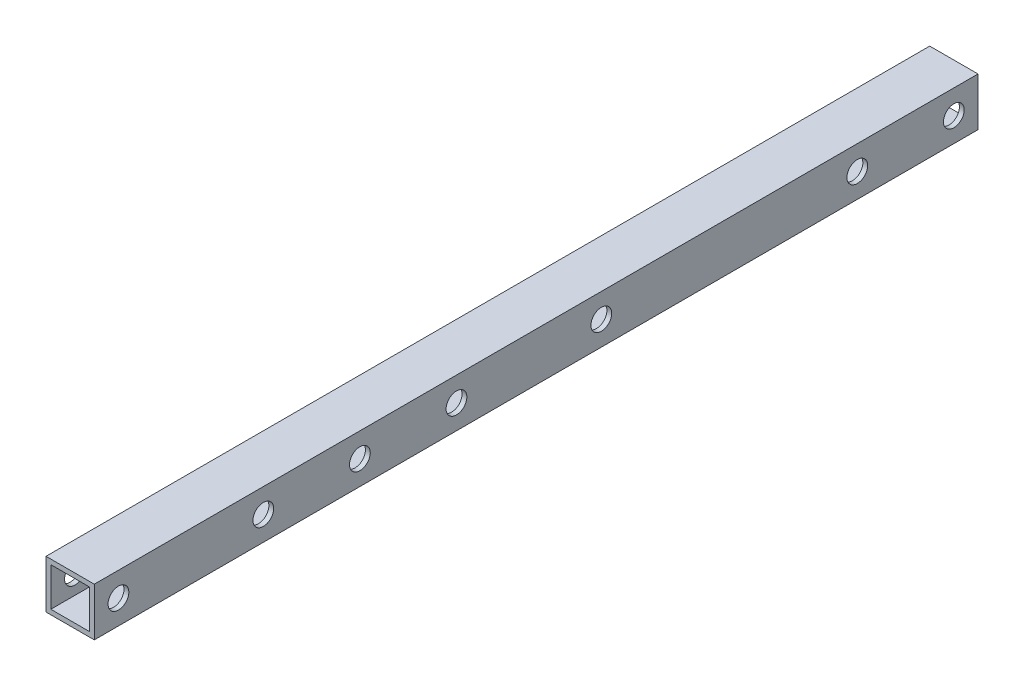
ISO-10303-21;
HEADER;
FILE_DESCRIPTION(('STEP AP214'),'2;1');
FILE_NAME('part.step','',(''),(''),'','','');
FILE_SCHEMA(('AUTOMOTIVE_DESIGN { 1 0 10303 214 1 1 1 1 }'));
ENDSEC;
DATA;
#1=APPLICATION_CONTEXT('core data for automotive mechanical design processes');
#2=APPLICATION_PROTOCOL_DEFINITION('international standard','automotive_design',2000,#1);
#3=PRODUCT_CONTEXT('',#1,'mechanical');
#4=PRODUCT('Part','Part','',(#3));
#5=PRODUCT_RELATED_PRODUCT_CATEGORY('part','',(#4));
#6=PRODUCT_DEFINITION_FORMATION('','',#4);
#7=PRODUCT_DEFINITION_CONTEXT('part definition',#1,'design');
#8=PRODUCT_DEFINITION('design','',#6,#7);
#9=PRODUCT_DEFINITION_SHAPE('','',#8);
#10=(LENGTH_UNIT() NAMED_UNIT(*) SI_UNIT(.MILLI.,.METRE.));
#11=(NAMED_UNIT(*) PLANE_ANGLE_UNIT() SI_UNIT($,.RADIAN.));
#12=(NAMED_UNIT(*) SI_UNIT($,.STERADIAN.) SOLID_ANGLE_UNIT());
#13=UNCERTAINTY_MEASURE_WITH_UNIT(LENGTH_MEASURE(1.E-05),#10,'distance_accuracy_value','');
#14=(GEOMETRIC_REPRESENTATION_CONTEXT(3) GLOBAL_UNCERTAINTY_ASSIGNED_CONTEXT((#13)) GLOBAL_UNIT_ASSIGNED_CONTEXT((#10,
#11,#12)) REPRESENTATION_CONTEXT('',''));
#15=CARTESIAN_POINT('',(0.,0.,0.));
#16=DIRECTION('',(0.,0.,1.));
#17=DIRECTION('',(1.,0.,0.));
#18=AXIS2_PLACEMENT_3D('',#15,#16,#17);
#19=CARTESIAN_POINT('',(0.,0.,183.));
#20=DIRECTION('',(0.,0.,1.));
#21=DIRECTION('',(1.,0.,0.));
#22=AXIS2_PLACEMENT_3D('',#19,#20,#21);
#23=PLANE('',#22);
#24=DIRECTION('',(0.,1.,0.));
#25=VECTOR('',#24,1.);
#26=CARTESIAN_POINT('',(5.,5.,183.));
#27=LINE('',#26,#25);
#28=CARTESIAN_POINT('',(5.,-5.,183.));
#29=VERTEX_POINT('',#28);
#30=CARTESIAN_POINT('',(5.,5.,183.));
#31=VERTEX_POINT('',#30);
#32=EDGE_CURVE('E164',#29,#31,#27,.T.);
#33=ORIENTED_EDGE('',*,*,#32,.T.);
#34=DIRECTION('',(-1.,0.,0.));
#35=VECTOR('',#34,1.);
#36=CARTESIAN_POINT('',(-5.,5.,183.));
#37=LINE('',#36,#35);
#38=CARTESIAN_POINT('',(-5.,5.,183.));
#39=VERTEX_POINT('',#38);
#40=EDGE_CURVE('E167',#31,#39,#37,.T.);
#41=ORIENTED_EDGE('',*,*,#40,.T.);
#42=DIRECTION('',(0.,-1.,0.));
#43=VECTOR('',#42,1.);
#44=CARTESIAN_POINT('',(-5.,5.,183.));
#45=LINE('',#44,#43);
#46=CARTESIAN_POINT('',(-5.,-5.,183.));
#47=VERTEX_POINT('',#46);
#48=EDGE_CURVE('E170',#39,#47,#45,.T.);
#49=ORIENTED_EDGE('',*,*,#48,.T.);
#50=DIRECTION('',(1.,0.,0.));
#51=VECTOR('',#50,1.);
#52=CARTESIAN_POINT('',(-5.,-5.,183.));
#53=LINE('',#52,#51);
#54=EDGE_CURVE('E172',#47,#29,#53,.T.);
#55=ORIENTED_EDGE('',*,*,#54,.T.);
#56=EDGE_LOOP('',(#33,#41,#49,#55));
#57=FACE_BOUND('',#56,.T.);
#58=DIRECTION('',(-1.,0.,0.));
#59=VECTOR('',#58,1.);
#60=CARTESIAN_POINT('',(-5.,4.,183.));
#61=LINE('',#60,#59);
#62=CARTESIAN_POINT('',(4.,4.,183.));
#63=VERTEX_POINT('',#62);
#64=CARTESIAN_POINT('',(-4.,4.,183.));
#65=VERTEX_POINT('',#64);
#66=EDGE_CURVE('E134',#63,#65,#61,.T.);
#67=ORIENTED_EDGE('',*,*,#66,.F.);
#68=DIRECTION('',(0.,1.,0.));
#69=VECTOR('',#68,1.);
#70=CARTESIAN_POINT('',(4.,5.,183.));
#71=LINE('',#70,#69);
#72=CARTESIAN_POINT('',(4.,-4.,183.));
#73=VERTEX_POINT('',#72);
#74=EDGE_CURVE('E126',#73,#63,#71,.T.);
#75=ORIENTED_EDGE('',*,*,#74,.F.);
#76=DIRECTION('',(1.,0.,0.));
#77=VECTOR('',#76,1.);
#78=CARTESIAN_POINT('',(-5.,-4.,183.));
#79=LINE('',#78,#77);
#80=CARTESIAN_POINT('',(-4.,-4.,183.));
#81=VERTEX_POINT('',#80);
#82=EDGE_CURVE('E148',#81,#73,#79,.T.);
#83=ORIENTED_EDGE('',*,*,#82,.F.);
#84=DIRECTION('',(0.,-1.,0.));
#85=VECTOR('',#84,1.);
#86=CARTESIAN_POINT('',(-4.,5.,183.));
#87=LINE('',#86,#85);
#88=EDGE_CURVE('E146',#65,#81,#87,.T.);
#89=ORIENTED_EDGE('',*,*,#88,.F.);
#90=EDGE_LOOP('',(#67,#75,#83,#89));
#91=FACE_BOUND('',#90,.T.);
#92=ADVANCED_FACE('F59',(#57,#91),#23,.T.);
#93=CARTESIAN_POINT('',(0.,0.,0.));
#94=DIRECTION('',(0.,0.,1.));
#95=DIRECTION('',(1.,0.,0.));
#96=AXIS2_PLACEMENT_3D('',#93,#94,#95);
#97=PLANE('',#96);
#98=DIRECTION('',(0.,1.,0.));
#99=VECTOR('',#98,1.);
#100=CARTESIAN_POINT('',(5.,5.,0.));
#101=LINE('',#100,#99);
#102=CARTESIAN_POINT('',(5.,-5.,0.));
#103=VERTEX_POINT('',#102);
#104=CARTESIAN_POINT('',(5.,5.,0.));
#105=VERTEX_POINT('',#104);
#106=EDGE_CURVE('E142',#103,#105,#101,.T.);
#107=ORIENTED_EDGE('',*,*,#106,.F.);
#108=DIRECTION('',(1.,0.,0.));
#109=VECTOR('',#108,1.);
#110=CARTESIAN_POINT('',(-5.,-5.,0.));
#111=LINE('',#110,#109);
#112=CARTESIAN_POINT('',(-5.,-5.,0.));
#113=VERTEX_POINT('',#112);
#114=EDGE_CURVE('E168',#113,#103,#111,.T.);
#115=ORIENTED_EDGE('',*,*,#114,.F.);
#116=DIRECTION('',(0.,-1.,0.));
#117=VECTOR('',#116,1.);
#118=CARTESIAN_POINT('',(-5.,5.,0.));
#119=LINE('',#118,#117);
#120=CARTESIAN_POINT('',(-5.,5.,0.));
#121=VERTEX_POINT('',#120);
#122=EDGE_CURVE('E179',#121,#113,#119,.T.);
#123=ORIENTED_EDGE('',*,*,#122,.F.);
#124=DIRECTION('',(-1.,0.,0.));
#125=VECTOR('',#124,1.);
#126=CARTESIAN_POINT('',(-5.,5.,0.));
#127=LINE('',#126,#125);
#128=EDGE_CURVE('E177',#105,#121,#127,.T.);
#129=ORIENTED_EDGE('',*,*,#128,.F.);
#130=EDGE_LOOP('',(#107,#115,#123,#129));
#131=FACE_BOUND('',#130,.T.);
#132=DIRECTION('',(0.,1.,0.));
#133=VECTOR('',#132,1.);
#134=CARTESIAN_POINT('',(4.,5.,0.));
#135=LINE('',#134,#133);
#136=CARTESIAN_POINT('',(4.,-4.,0.));
#137=VERTEX_POINT('',#136);
#138=CARTESIAN_POINT('',(4.,4.,0.));
#139=VERTEX_POINT('',#138);
#140=EDGE_CURVE('E84',#137,#139,#135,.T.);
#141=ORIENTED_EDGE('',*,*,#140,.T.);
#142=DIRECTION('',(-1.,0.,0.));
#143=VECTOR('',#142,1.);
#144=CARTESIAN_POINT('',(-5.,4.,0.));
#145=LINE('',#144,#143);
#146=CARTESIAN_POINT('',(-4.,4.,0.));
#147=VERTEX_POINT('',#146);
#148=EDGE_CURVE('E141',#139,#147,#145,.T.);
#149=ORIENTED_EDGE('',*,*,#148,.T.);
#150=DIRECTION('',(0.,-1.,0.));
#151=VECTOR('',#150,1.);
#152=CARTESIAN_POINT('',(-4.,5.,0.));
#153=LINE('',#152,#151);
#154=CARTESIAN_POINT('',(-4.,-4.,0.));
#155=VERTEX_POINT('',#154);
#156=EDGE_CURVE('E156',#147,#155,#153,.T.);
#157=ORIENTED_EDGE('',*,*,#156,.T.);
#158=DIRECTION('',(1.,0.,0.));
#159=VECTOR('',#158,1.);
#160=CARTESIAN_POINT('',(-5.,-4.,0.));
#161=LINE('',#160,#159);
#162=EDGE_CURVE('E135',#155,#137,#161,.T.);
#163=ORIENTED_EDGE('',*,*,#162,.T.);
#164=EDGE_LOOP('',(#141,#149,#157,#163));
#165=FACE_BOUND('',#164,.T.);
#166=ADVANCED_FACE('F249',(#131,#165),#97,.F.);
#167=CARTESIAN_POINT('',(5.,5.,183.));
#168=DIRECTION('',(-1.,0.,0.));
#169=DIRECTION('',(0.,-1.,0.));
#170=AXIS2_PLACEMENT_3D('',#167,#168,#169);
#171=PLANE('',#170);
#172=CARTESIAN_POINT('',(5.,0.,25.));
#173=DIRECTION('',(1.,0.,0.));
#174=DIRECTION('',(0.,1.,0.));
#175=AXIS2_PLACEMENT_3D('',#172,#173,#174);
#176=CIRCLE('',#175,2.15);
#177=CARTESIAN_POINT('',(5.,2.15,25.));
#178=VERTEX_POINT('',#177);
#179=EDGE_CURVE('E302',#178,#178,#176,.T.);
#180=ORIENTED_EDGE('',*,*,#179,.F.);
#181=EDGE_LOOP('',(#180));
#182=FACE_BOUND('',#181,.T.);
#183=CARTESIAN_POINT('',(5.,0.,5.));
#184=DIRECTION('',(1.,0.,0.));
#185=DIRECTION('',(0.,-1.,0.));
#186=AXIS2_PLACEMENT_3D('',#183,#184,#185);
#187=CIRCLE('',#186,2.14999999999996);
#188=CARTESIAN_POINT('',(5.,-2.14999999999996,5.));
#189=VERTEX_POINT('',#188);
#190=EDGE_CURVE('E306',#189,#189,#187,.T.);
#191=ORIENTED_EDGE('',*,*,#190,.F.);
#192=EDGE_LOOP('',(#191));
#193=FACE_BOUND('',#192,.T.);
#194=CARTESIAN_POINT('',(5.,0.,108.));
#195=DIRECTION('',(1.,0.,0.));
#196=DIRECTION('',(0.,1.,0.));
#197=AXIS2_PLACEMENT_3D('',#194,#195,#196);
#198=CIRCLE('',#197,2.15000000000002);
#199=CARTESIAN_POINT('',(5.,2.15000000000002,108.));
#200=VERTEX_POINT('',#199);
#201=EDGE_CURVE('E310',#200,#200,#198,.T.);
#202=ORIENTED_EDGE('',*,*,#201,.F.);
#203=EDGE_LOOP('',(#202));
#204=FACE_BOUND('',#203,.T.);
#205=CARTESIAN_POINT('',(5.,0.,148.));
#206=DIRECTION('',(1.,0.,0.));
#207=DIRECTION('',(0.,-1.,0.));
#208=AXIS2_PLACEMENT_3D('',#205,#206,#207);
#209=CIRCLE('',#208,2.15000000000002);
#210=CARTESIAN_POINT('',(5.,-2.15000000000002,148.));
#211=VERTEX_POINT('',#210);
#212=EDGE_CURVE('E314',#211,#211,#209,.T.);
#213=ORIENTED_EDGE('',*,*,#212,.F.);
#214=EDGE_LOOP('',(#213));
#215=FACE_BOUND('',#214,.T.);
#216=CARTESIAN_POINT('',(5.,0.,178.));
#217=DIRECTION('',(1.,0.,0.));
#218=DIRECTION('',(0.,1.,0.));
#219=AXIS2_PLACEMENT_3D('',#216,#217,#218);
#220=CIRCLE('',#219,2.15000000000002);
#221=CARTESIAN_POINT('',(5.,2.15000000000001,178.));
#222=VERTEX_POINT('',#221);
#223=EDGE_CURVE('E318',#222,#222,#220,.T.);
#224=ORIENTED_EDGE('',*,*,#223,.F.);
#225=EDGE_LOOP('',(#224));
#226=FACE_BOUND('',#225,.T.);
#227=CARTESIAN_POINT('',(5.,0.,78.));
#228=DIRECTION('',(1.,0.,0.));
#229=DIRECTION('',(0.,-1.,0.));
#230=AXIS2_PLACEMENT_3D('',#227,#228,#229);
#231=CIRCLE('',#230,2.15000000000002);
#232=CARTESIAN_POINT('',(5.,-2.15000000000001,78.));
#233=VERTEX_POINT('',#232);
#234=EDGE_CURVE('E322',#233,#233,#231,.T.);
#235=ORIENTED_EDGE('',*,*,#234,.F.);
#236=EDGE_LOOP('',(#235));
#237=FACE_BOUND('',#236,.T.);
#238=CARTESIAN_POINT('',(5.,0.,128.));
#239=DIRECTION('',(1.,0.,0.));
#240=DIRECTION('',(0.,1.,0.));
#241=AXIS2_PLACEMENT_3D('',#238,#239,#240);
#242=CIRCLE('',#241,2.15000000000002);
#243=CARTESIAN_POINT('',(5.,2.15000000000002,128.));
#244=VERTEX_POINT('',#243);
#245=EDGE_CURVE('E325',#244,#244,#242,.T.);
#246=ORIENTED_EDGE('',*,*,#245,.F.);
#247=EDGE_LOOP('',(#246));
#248=FACE_BOUND('',#247,.T.);
#249=ORIENTED_EDGE('',*,*,#106,.T.);
#250=DIRECTION('',(0.,0.,-1.));
#251=VECTOR('',#250,1.);
#252=CARTESIAN_POINT('',(5.,5.,183.));
#253=LINE('',#252,#251);
#254=EDGE_CURVE('E12',#31,#105,#253,.T.);
#255=ORIENTED_EDGE('',*,*,#254,.F.);
#256=ORIENTED_EDGE('',*,*,#32,.F.);
#257=DIRECTION('',(0.,0.,-1.));
#258=VECTOR('',#257,1.);
#259=CARTESIAN_POINT('',(5.,-5.,183.));
#260=LINE('',#259,#258);
#261=EDGE_CURVE('E174',#29,#103,#260,.T.);
#262=ORIENTED_EDGE('',*,*,#261,.T.);
#263=EDGE_LOOP('',(#249,#255,#256,#262));
#264=FACE_BOUND('',#263,.T.);
#265=ADVANCED_FACE('F61',(#182,#193,#204,#215,#226,#237,#248,#264),#171,.F.);
#266=CARTESIAN_POINT('',(-5.,5.,183.));
#267=DIRECTION('',(0.,-1.,0.));
#268=DIRECTION('',(0.,0.,-1.));
#269=AXIS2_PLACEMENT_3D('',#266,#267,#268);
#270=PLANE('',#269);
#271=ORIENTED_EDGE('',*,*,#128,.T.);
#272=DIRECTION('',(0.,0.,-1.));
#273=VECTOR('',#272,1.);
#274=CARTESIAN_POINT('',(-5.,5.,183.));
#275=LINE('',#274,#273);
#276=EDGE_CURVE('E68',#39,#121,#275,.T.);
#277=ORIENTED_EDGE('',*,*,#276,.F.);
#278=ORIENTED_EDGE('',*,*,#40,.F.);
#279=ORIENTED_EDGE('',*,*,#254,.T.);
#280=EDGE_LOOP('',(#271,#277,#278,#279));
#281=FACE_BOUND('',#280,.T.);
#282=ADVANCED_FACE('F277',(#281),#270,.F.);
#283=CARTESIAN_POINT('',(-5.,5.,183.));
#284=DIRECTION('',(1.,0.,0.));
#285=DIRECTION('',(0.,1.,0.));
#286=AXIS2_PLACEMENT_3D('',#283,#284,#285);
#287=PLANE('',#286);
#288=CARTESIAN_POINT('',(-5.,0.,25.));
#289=DIRECTION('',(1.,0.,0.));
#290=DIRECTION('',(0.,1.,0.));
#291=AXIS2_PLACEMENT_3D('',#288,#289,#290);
#292=CIRCLE('',#291,2.15);
#293=CARTESIAN_POINT('',(-5.,2.15,25.));
#294=VERTEX_POINT('',#293);
#295=EDGE_CURVE('E408',#294,#294,#292,.T.);
#296=ORIENTED_EDGE('',*,*,#295,.T.);
#297=EDGE_LOOP('',(#296));
#298=FACE_BOUND('',#297,.T.);
#299=CARTESIAN_POINT('',(-5.,0.,5.));
#300=DIRECTION('',(1.,0.,0.));
#301=DIRECTION('',(0.,-1.,0.));
#302=AXIS2_PLACEMENT_3D('',#299,#300,#301);
#303=CIRCLE('',#302,2.14999999999996);
#304=CARTESIAN_POINT('',(-5.,-2.14999999999996,5.));
#305=VERTEX_POINT('',#304);
#306=EDGE_CURVE('E404',#305,#305,#303,.T.);
#307=ORIENTED_EDGE('',*,*,#306,.T.);
#308=EDGE_LOOP('',(#307));
#309=FACE_BOUND('',#308,.T.);
#310=CARTESIAN_POINT('',(-5.,0.,108.));
#311=DIRECTION('',(1.,0.,0.));
#312=DIRECTION('',(0.,1.,0.));
#313=AXIS2_PLACEMENT_3D('',#310,#311,#312);
#314=CIRCLE('',#313,2.15000000000002);
#315=CARTESIAN_POINT('',(-5.,2.15000000000001,108.));
#316=VERTEX_POINT('',#315);
#317=EDGE_CURVE('E327',#316,#316,#314,.T.);
#318=ORIENTED_EDGE('',*,*,#317,.T.);
#319=EDGE_LOOP('',(#318));
#320=FACE_BOUND('',#319,.T.);
#321=CARTESIAN_POINT('',(-5.,0.,148.));
#322=DIRECTION('',(1.,0.,0.));
#323=DIRECTION('',(0.,-1.,0.));
#324=AXIS2_PLACEMENT_3D('',#321,#322,#323);
#325=CIRCLE('',#324,2.15000000000002);
#326=CARTESIAN_POINT('',(-5.,-2.15000000000002,148.));
#327=VERTEX_POINT('',#326);
#328=EDGE_CURVE('E395',#327,#327,#325,.T.);
#329=ORIENTED_EDGE('',*,*,#328,.T.);
#330=EDGE_LOOP('',(#329));
#331=FACE_BOUND('',#330,.T.);
#332=CARTESIAN_POINT('',(-5.,0.,178.));
#333=DIRECTION('',(1.,0.,0.));
#334=DIRECTION('',(0.,1.,0.));
#335=AXIS2_PLACEMENT_3D('',#332,#333,#334);
#336=CIRCLE('',#335,2.15000000000002);
#337=CARTESIAN_POINT('',(-5.,2.15000000000001,178.));
#338=VERTEX_POINT('',#337);
#339=EDGE_CURVE('E396',#338,#338,#336,.T.);
#340=ORIENTED_EDGE('',*,*,#339,.T.);
#341=EDGE_LOOP('',(#340));
#342=FACE_BOUND('',#341,.T.);
#343=CARTESIAN_POINT('',(-5.,0.,78.));
#344=DIRECTION('',(1.,0.,0.));
#345=DIRECTION('',(0.,-1.,0.));
#346=AXIS2_PLACEMENT_3D('',#343,#344,#345);
#347=CIRCLE('',#346,2.15000000000002);
#348=CARTESIAN_POINT('',(-5.,-2.15000000000001,78.));
#349=VERTEX_POINT('',#348);
#350=EDGE_CURVE('E561',#349,#349,#347,.T.);
#351=ORIENTED_EDGE('',*,*,#350,.T.);
#352=EDGE_LOOP('',(#351));
#353=FACE_BOUND('',#352,.T.);
#354=CARTESIAN_POINT('',(-5.,0.,128.));
#355=DIRECTION('',(1.,0.,0.));
#356=DIRECTION('',(0.,1.,0.));
#357=AXIS2_PLACEMENT_3D('',#354,#355,#356);
#358=CIRCLE('',#357,2.15000000000002);
#359=CARTESIAN_POINT('',(-5.,2.15000000000001,128.));
#360=VERTEX_POINT('',#359);
#361=EDGE_CURVE('E193',#360,#360,#358,.T.);
#362=ORIENTED_EDGE('',*,*,#361,.T.);
#363=EDGE_LOOP('',(#362));
#364=FACE_BOUND('',#363,.T.);
#365=ORIENTED_EDGE('',*,*,#122,.T.);
#366=DIRECTION('',(0.,0.,-1.));
#367=VECTOR('',#366,1.);
#368=CARTESIAN_POINT('',(-5.,-5.,183.));
#369=LINE('',#368,#367);
#370=EDGE_CURVE('E184',#47,#113,#369,.T.);
#371=ORIENTED_EDGE('',*,*,#370,.F.);
#372=ORIENTED_EDGE('',*,*,#48,.F.);
#373=ORIENTED_EDGE('',*,*,#276,.T.);
#374=EDGE_LOOP('',(#365,#371,#372,#373));
#375=FACE_BOUND('',#374,.T.);
#376=ADVANCED_FACE('F274',(#298,#309,#320,#331,#342,#353,#364,#375),#287,.F.);
#377=CARTESIAN_POINT('',(-5.,-5.,183.));
#378=DIRECTION('',(0.,1.,0.));
#379=DIRECTION('',(0.,0.,1.));
#380=AXIS2_PLACEMENT_3D('',#377,#378,#379);
#381=PLANE('',#380);
#382=ORIENTED_EDGE('',*,*,#114,.T.);
#383=ORIENTED_EDGE('',*,*,#261,.F.);
#384=ORIENTED_EDGE('',*,*,#54,.F.);
#385=ORIENTED_EDGE('',*,*,#370,.T.);
#386=EDGE_LOOP('',(#382,#383,#384,#385));
#387=FACE_BOUND('',#386,.T.);
#388=ADVANCED_FACE('F271',(#387),#381,.F.);
#389=CARTESIAN_POINT('',(4.,5.,183.));
#390=DIRECTION('',(-1.,0.,0.));
#391=DIRECTION('',(0.,-1.,0.));
#392=AXIS2_PLACEMENT_3D('',#389,#390,#391);
#393=PLANE('',#392);
#394=CARTESIAN_POINT('',(4.,0.,25.));
#395=DIRECTION('',(-1.,0.,0.));
#396=DIRECTION('',(0.,-1.,0.));
#397=AXIS2_PLACEMENT_3D('',#394,#395,#396);
#398=CIRCLE('',#397,2.15);
#399=CARTESIAN_POINT('',(4.,-2.15,25.));
#400=VERTEX_POINT('',#399);
#401=EDGE_CURVE('E154',#400,#400,#398,.T.);
#402=ORIENTED_EDGE('',*,*,#401,.F.);
#403=EDGE_LOOP('',(#402));
#404=FACE_BOUND('',#403,.T.);
#405=CARTESIAN_POINT('',(4.,0.,5.));
#406=DIRECTION('',(-1.,0.,0.));
#407=DIRECTION('',(0.,-1.,0.));
#408=AXIS2_PLACEMENT_3D('',#405,#406,#407);
#409=CIRCLE('',#408,2.14999999999996);
#410=CARTESIAN_POINT('',(4.,-2.14999999999996,5.));
#411=VERTEX_POINT('',#410);
#412=EDGE_CURVE('E211',#411,#411,#409,.T.);
#413=ORIENTED_EDGE('',*,*,#412,.F.);
#414=EDGE_LOOP('',(#413));
#415=FACE_BOUND('',#414,.T.);
#416=CARTESIAN_POINT('',(4.,0.,108.));
#417=DIRECTION('',(-1.,0.,0.));
#418=DIRECTION('',(0.,-1.,0.));
#419=AXIS2_PLACEMENT_3D('',#416,#417,#418);
#420=CIRCLE('',#419,2.15000000000002);
#421=CARTESIAN_POINT('',(4.,-2.15000000000002,108.));
#422=VERTEX_POINT('',#421);
#423=EDGE_CURVE('E208',#422,#422,#420,.T.);
#424=ORIENTED_EDGE('',*,*,#423,.F.);
#425=EDGE_LOOP('',(#424));
#426=FACE_BOUND('',#425,.T.);
#427=CARTESIAN_POINT('',(4.,0.,148.));
#428=DIRECTION('',(-1.,0.,0.));
#429=DIRECTION('',(0.,-1.,0.));
#430=AXIS2_PLACEMENT_3D('',#427,#428,#429);
#431=CIRCLE('',#430,2.15000000000002);
#432=CARTESIAN_POINT('',(4.,-2.15000000000002,148.));
#433=VERTEX_POINT('',#432);
#434=EDGE_CURVE('E205',#433,#433,#431,.T.);
#435=ORIENTED_EDGE('',*,*,#434,.F.);
#436=EDGE_LOOP('',(#435));
#437=FACE_BOUND('',#436,.T.);
#438=CARTESIAN_POINT('',(4.,0.,178.));
#439=DIRECTION('',(-1.,0.,0.));
#440=DIRECTION('',(0.,-1.,0.));
#441=AXIS2_PLACEMENT_3D('',#438,#439,#440);
#442=CIRCLE('',#441,2.15000000000002);
#443=CARTESIAN_POINT('',(4.,-2.15000000000002,178.));
#444=VERTEX_POINT('',#443);
#445=EDGE_CURVE('E201',#444,#444,#442,.T.);
#446=ORIENTED_EDGE('',*,*,#445,.F.);
#447=EDGE_LOOP('',(#446));
#448=FACE_BOUND('',#447,.T.);
#449=CARTESIAN_POINT('',(4.,0.,78.));
#450=DIRECTION('',(-1.,0.,0.));
#451=DIRECTION('',(0.,-1.,0.));
#452=AXIS2_PLACEMENT_3D('',#449,#450,#451);
#453=CIRCLE('',#452,2.15000000000002);
#454=CARTESIAN_POINT('',(4.,-2.15000000000001,78.));
#455=VERTEX_POINT('',#454);
#456=EDGE_CURVE('E197',#455,#455,#453,.T.);
#457=ORIENTED_EDGE('',*,*,#456,.F.);
#458=EDGE_LOOP('',(#457));
#459=FACE_BOUND('',#458,.T.);
#460=CARTESIAN_POINT('',(4.,0.,128.));
#461=DIRECTION('',(-1.,0.,0.));
#462=DIRECTION('',(0.,-1.,0.));
#463=AXIS2_PLACEMENT_3D('',#460,#461,#462);
#464=CIRCLE('',#463,2.15000000000002);
#465=CARTESIAN_POINT('',(4.,-2.15000000000002,128.));
#466=VERTEX_POINT('',#465);
#467=EDGE_CURVE('E192',#466,#466,#464,.T.);
#468=ORIENTED_EDGE('',*,*,#467,.F.);
#469=EDGE_LOOP('',(#468));
#470=FACE_BOUND('',#469,.T.);
#471=ORIENTED_EDGE('',*,*,#140,.F.);
#472=DIRECTION('',(0.,0.,-1.));
#473=VECTOR('',#472,1.);
#474=CARTESIAN_POINT('',(4.,-4.,183.));
#475=LINE('',#474,#473);
#476=EDGE_CURVE('E130',#73,#137,#475,.T.);
#477=ORIENTED_EDGE('',*,*,#476,.F.);
#478=ORIENTED_EDGE('',*,*,#74,.T.);
#479=DIRECTION('',(0.,0.,-1.));
#480=VECTOR('',#479,1.);
#481=CARTESIAN_POINT('',(4.,4.,183.));
#482=LINE('',#481,#480);
#483=EDGE_CURVE('E129',#63,#139,#482,.T.);
#484=ORIENTED_EDGE('',*,*,#483,.T.);
#485=EDGE_LOOP('',(#471,#477,#478,#484));
#486=FACE_BOUND('',#485,.T.);
#487=ADVANCED_FACE('F128',(#404,#415,#426,#437,#448,#459,#470,#486),#393,.T.);
#488=CARTESIAN_POINT('',(-5.,4.,183.));
#489=DIRECTION('',(0.,-1.,0.));
#490=DIRECTION('',(0.,0.,-1.));
#491=AXIS2_PLACEMENT_3D('',#488,#489,#490);
#492=PLANE('',#491);
#493=ORIENTED_EDGE('',*,*,#148,.F.);
#494=ORIENTED_EDGE('',*,*,#483,.F.);
#495=ORIENTED_EDGE('',*,*,#66,.T.);
#496=DIRECTION('',(0.,0.,-1.));
#497=VECTOR('',#496,1.);
#498=CARTESIAN_POINT('',(-4.,4.,183.));
#499=LINE('',#498,#497);
#500=EDGE_CURVE('E143',#65,#147,#499,.T.);
#501=ORIENTED_EDGE('',*,*,#500,.T.);
#502=EDGE_LOOP('',(#493,#494,#495,#501));
#503=FACE_BOUND('',#502,.T.);
#504=ADVANCED_FACE('F138',(#503),#492,.T.);
#505=CARTESIAN_POINT('',(-4.,5.,183.));
#506=DIRECTION('',(1.,0.,0.));
#507=DIRECTION('',(0.,1.,0.));
#508=AXIS2_PLACEMENT_3D('',#505,#506,#507);
#509=PLANE('',#508);
#510=CARTESIAN_POINT('',(-4.,0.,25.));
#511=DIRECTION('',(1.,0.,0.));
#512=DIRECTION('',(0.,1.,0.));
#513=AXIS2_PLACEMENT_3D('',#510,#511,#512);
#514=CIRCLE('',#513,2.15);
#515=CARTESIAN_POINT('',(-4.,2.15,25.));
#516=VERTEX_POINT('',#515);
#517=EDGE_CURVE('E63',#516,#516,#514,.T.);
#518=ORIENTED_EDGE('',*,*,#517,.F.);
#519=EDGE_LOOP('',(#518));
#520=FACE_BOUND('',#519,.T.);
#521=CARTESIAN_POINT('',(-4.,0.,5.));
#522=DIRECTION('',(1.,0.,0.));
#523=DIRECTION('',(0.,1.,0.));
#524=AXIS2_PLACEMENT_3D('',#521,#522,#523);
#525=CIRCLE('',#524,2.14999999999996);
#526=CARTESIAN_POINT('',(-4.,2.14999999999996,5.));
#527=VERTEX_POINT('',#526);
#528=EDGE_CURVE('E209',#527,#527,#525,.T.);
#529=ORIENTED_EDGE('',*,*,#528,.F.);
#530=EDGE_LOOP('',(#529));
#531=FACE_BOUND('',#530,.T.);
#532=CARTESIAN_POINT('',(-4.,0.,108.));
#533=DIRECTION('',(1.,0.,0.));
#534=DIRECTION('',(0.,1.,0.));
#535=AXIS2_PLACEMENT_3D('',#532,#533,#534);
#536=CIRCLE('',#535,2.15000000000002);
#537=CARTESIAN_POINT('',(-4.,2.15000000000001,108.));
#538=VERTEX_POINT('',#537);
#539=EDGE_CURVE('E206',#538,#538,#536,.T.);
#540=ORIENTED_EDGE('',*,*,#539,.F.);
#541=EDGE_LOOP('',(#540));
#542=FACE_BOUND('',#541,.T.);
#543=CARTESIAN_POINT('',(-4.,0.,148.));
#544=DIRECTION('',(1.,0.,0.));
#545=DIRECTION('',(0.,1.,0.));
#546=AXIS2_PLACEMENT_3D('',#543,#544,#545);
#547=CIRCLE('',#546,2.15000000000002);
#548=CARTESIAN_POINT('',(-4.,2.15000000000001,148.));
#549=VERTEX_POINT('',#548);
#550=EDGE_CURVE('E202',#549,#549,#547,.T.);
#551=ORIENTED_EDGE('',*,*,#550,.F.);
#552=EDGE_LOOP('',(#551));
#553=FACE_BOUND('',#552,.T.);
#554=CARTESIAN_POINT('',(-4.,0.,178.));
#555=DIRECTION('',(1.,0.,0.));
#556=DIRECTION('',(0.,1.,0.));
#557=AXIS2_PLACEMENT_3D('',#554,#555,#556);
#558=CIRCLE('',#557,2.15000000000002);
#559=CARTESIAN_POINT('',(-4.,2.15000000000001,178.));
#560=VERTEX_POINT('',#559);
#561=EDGE_CURVE('E198',#560,#560,#558,.T.);
#562=ORIENTED_EDGE('',*,*,#561,.F.);
#563=EDGE_LOOP('',(#562));
#564=FACE_BOUND('',#563,.T.);
#565=CARTESIAN_POINT('',(-4.,0.,78.));
#566=DIRECTION('',(1.,0.,0.));
#567=DIRECTION('',(0.,1.,0.));
#568=AXIS2_PLACEMENT_3D('',#565,#566,#567);
#569=CIRCLE('',#568,2.15000000000002);
#570=CARTESIAN_POINT('',(-4.,2.15000000000002,78.));
#571=VERTEX_POINT('',#570);
#572=EDGE_CURVE('E194',#571,#571,#569,.T.);
#573=ORIENTED_EDGE('',*,*,#572,.F.);
#574=EDGE_LOOP('',(#573));
#575=FACE_BOUND('',#574,.T.);
#576=CARTESIAN_POINT('',(-4.,0.,128.));
#577=DIRECTION('',(1.,0.,0.));
#578=DIRECTION('',(0.,1.,0.));
#579=AXIS2_PLACEMENT_3D('',#576,#577,#578);
#580=CIRCLE('',#579,2.15000000000002);
#581=CARTESIAN_POINT('',(-4.,2.15000000000001,128.));
#582=VERTEX_POINT('',#581);
#583=EDGE_CURVE('E189',#582,#582,#580,.T.);
#584=ORIENTED_EDGE('',*,*,#583,.F.);
#585=EDGE_LOOP('',(#584));
#586=FACE_BOUND('',#585,.T.);
#587=ORIENTED_EDGE('',*,*,#156,.F.);
#588=ORIENTED_EDGE('',*,*,#500,.F.);
#589=ORIENTED_EDGE('',*,*,#88,.T.);
#590=DIRECTION('',(0.,0.,-1.));
#591=VECTOR('',#590,1.);
#592=CARTESIAN_POINT('',(-4.,-4.,183.));
#593=LINE('',#592,#591);
#594=EDGE_CURVE('E76',#81,#155,#593,.T.);
#595=ORIENTED_EDGE('',*,*,#594,.T.);
#596=EDGE_LOOP('',(#587,#588,#589,#595));
#597=FACE_BOUND('',#596,.T.);
#598=ADVANCED_FACE('F231',(#520,#531,#542,#553,#564,#575,#586,#597),#509,.T.);
#599=CARTESIAN_POINT('',(-5.,-4.,183.));
#600=DIRECTION('',(0.,1.,0.));
#601=DIRECTION('',(0.,0.,1.));
#602=AXIS2_PLACEMENT_3D('',#599,#600,#601);
#603=PLANE('',#602);
#604=ORIENTED_EDGE('',*,*,#162,.F.);
#605=ORIENTED_EDGE('',*,*,#594,.F.);
#606=ORIENTED_EDGE('',*,*,#82,.T.);
#607=ORIENTED_EDGE('',*,*,#476,.T.);
#608=EDGE_LOOP('',(#604,#605,#606,#607));
#609=FACE_BOUND('',#608,.T.);
#610=ADVANCED_FACE('F234',(#609),#603,.T.);
#611=CARTESIAN_POINT('',(-5.,0.,128.));
#612=DIRECTION('',(1.,0.,0.));
#613=DIRECTION('',(0.,1.,0.));
#614=AXIS2_PLACEMENT_3D('',#611,#612,#613);
#615=CYLINDRICAL_SURFACE('',#614,2.15000000000002);
#616=ORIENTED_EDGE('',*,*,#583,.T.);
#617=EDGE_LOOP('',(#616));
#618=FACE_BOUND('',#617,.T.);
#619=ORIENTED_EDGE('',*,*,#361,.F.);
#620=EDGE_LOOP('',(#619));
#621=FACE_BOUND('',#620,.T.);
#622=ADVANCED_FACE('F251',(#618,#621),#615,.F.);
#623=CARTESIAN_POINT('',(-5.,0.,78.));
#624=DIRECTION('',(1.,0.,0.));
#625=DIRECTION('',(0.,1.,0.));
#626=AXIS2_PLACEMENT_3D('',#623,#624,#625);
#627=CYLINDRICAL_SURFACE('',#626,2.15000000000002);
#628=ORIENTED_EDGE('',*,*,#572,.T.);
#629=EDGE_LOOP('',(#628));
#630=FACE_BOUND('',#629,.T.);
#631=ORIENTED_EDGE('',*,*,#350,.F.);
#632=EDGE_LOOP('',(#631));
#633=FACE_BOUND('',#632,.T.);
#634=ADVANCED_FACE('F256',(#630,#633),#627,.F.);
#635=CARTESIAN_POINT('',(-5.,0.,178.));
#636=DIRECTION('',(1.,0.,0.));
#637=DIRECTION('',(0.,1.,0.));
#638=AXIS2_PLACEMENT_3D('',#635,#636,#637);
#639=CYLINDRICAL_SURFACE('',#638,2.15000000000002);
#640=ORIENTED_EDGE('',*,*,#561,.T.);
#641=EDGE_LOOP('',(#640));
#642=FACE_BOUND('',#641,.T.);
#643=ORIENTED_EDGE('',*,*,#339,.F.);
#644=EDGE_LOOP('',(#643));
#645=FACE_BOUND('',#644,.T.);
#646=ADVANCED_FACE('F370',(#642,#645),#639,.F.);
#647=CARTESIAN_POINT('',(-5.,0.,148.));
#648=DIRECTION('',(1.,0.,0.));
#649=DIRECTION('',(0.,1.,0.));
#650=AXIS2_PLACEMENT_3D('',#647,#648,#649);
#651=CYLINDRICAL_SURFACE('',#650,2.15000000000002);
#652=ORIENTED_EDGE('',*,*,#550,.T.);
#653=EDGE_LOOP('',(#652));
#654=FACE_BOUND('',#653,.T.);
#655=ORIENTED_EDGE('',*,*,#328,.F.);
#656=EDGE_LOOP('',(#655));
#657=FACE_BOUND('',#656,.T.);
#658=ADVANCED_FACE('F367',(#654,#657),#651,.F.);
#659=CARTESIAN_POINT('',(-5.,0.,108.));
#660=DIRECTION('',(1.,0.,0.));
#661=DIRECTION('',(0.,1.,0.));
#662=AXIS2_PLACEMENT_3D('',#659,#660,#661);
#663=CYLINDRICAL_SURFACE('',#662,2.15000000000002);
#664=ORIENTED_EDGE('',*,*,#539,.T.);
#665=EDGE_LOOP('',(#664));
#666=FACE_BOUND('',#665,.T.);
#667=ORIENTED_EDGE('',*,*,#317,.F.);
#668=EDGE_LOOP('',(#667));
#669=FACE_BOUND('',#668,.T.);
#670=ADVANCED_FACE('F365',(#666,#669),#663,.F.);
#671=CARTESIAN_POINT('',(-5.,0.,5.));
#672=DIRECTION('',(1.,0.,0.));
#673=DIRECTION('',(0.,1.,0.));
#674=AXIS2_PLACEMENT_3D('',#671,#672,#673);
#675=CYLINDRICAL_SURFACE('',#674,2.14999999999996);
#676=ORIENTED_EDGE('',*,*,#528,.T.);
#677=EDGE_LOOP('',(#676));
#678=FACE_BOUND('',#677,.T.);
#679=ORIENTED_EDGE('',*,*,#306,.F.);
#680=EDGE_LOOP('',(#679));
#681=FACE_BOUND('',#680,.T.);
#682=ADVANCED_FACE('F359',(#678,#681),#675,.F.);
#683=CARTESIAN_POINT('',(-5.,0.,25.));
#684=DIRECTION('',(1.,0.,0.));
#685=DIRECTION('',(0.,1.,0.));
#686=AXIS2_PLACEMENT_3D('',#683,#684,#685);
#687=CYLINDRICAL_SURFACE('',#686,2.15);
#688=ORIENTED_EDGE('',*,*,#517,.T.);
#689=EDGE_LOOP('',(#688));
#690=FACE_BOUND('',#689,.T.);
#691=ORIENTED_EDGE('',*,*,#295,.F.);
#692=EDGE_LOOP('',(#691));
#693=FACE_BOUND('',#692,.T.);
#694=ADVANCED_FACE('F228',(#690,#693),#687,.F.);
#695=ORIENTED_EDGE('',*,*,#467,.T.);
#696=EDGE_LOOP('',(#695));
#697=FACE_BOUND('',#696,.T.);
#698=ORIENTED_EDGE('',*,*,#245,.T.);
#699=EDGE_LOOP('',(#698));
#700=FACE_BOUND('',#699,.T.);
#701=ADVANCED_FACE('F259',(#697,#700),#615,.F.);
#702=ORIENTED_EDGE('',*,*,#456,.T.);
#703=EDGE_LOOP('',(#702));
#704=FACE_BOUND('',#703,.T.);
#705=ORIENTED_EDGE('',*,*,#234,.T.);
#706=EDGE_LOOP('',(#705));
#707=FACE_BOUND('',#706,.T.);
#708=ADVANCED_FACE('F352',(#704,#707),#627,.F.);
#709=ORIENTED_EDGE('',*,*,#445,.T.);
#710=EDGE_LOOP('',(#709));
#711=FACE_BOUND('',#710,.T.);
#712=ORIENTED_EDGE('',*,*,#223,.T.);
#713=EDGE_LOOP('',(#712));
#714=FACE_BOUND('',#713,.T.);
#715=ADVANCED_FACE('F341',(#711,#714),#639,.F.);
#716=ORIENTED_EDGE('',*,*,#434,.T.);
#717=EDGE_LOOP('',(#716));
#718=FACE_BOUND('',#717,.T.);
#719=ORIENTED_EDGE('',*,*,#212,.T.);
#720=EDGE_LOOP('',(#719));
#721=FACE_BOUND('',#720,.T.);
#722=ADVANCED_FACE('F372',(#718,#721),#651,.F.);
#723=ORIENTED_EDGE('',*,*,#423,.T.);
#724=EDGE_LOOP('',(#723));
#725=FACE_BOUND('',#724,.T.);
#726=ORIENTED_EDGE('',*,*,#201,.T.);
#727=EDGE_LOOP('',(#726));
#728=FACE_BOUND('',#727,.T.);
#729=ADVANCED_FACE('F375',(#725,#728),#663,.F.);
#730=ORIENTED_EDGE('',*,*,#412,.T.);
#731=EDGE_LOOP('',(#730));
#732=FACE_BOUND('',#731,.T.);
#733=ORIENTED_EDGE('',*,*,#190,.T.);
#734=EDGE_LOOP('',(#733));
#735=FACE_BOUND('',#734,.T.);
#736=ADVANCED_FACE('F366',(#732,#735),#675,.F.);
#737=ORIENTED_EDGE('',*,*,#401,.T.);
#738=EDGE_LOOP('',(#737));
#739=FACE_BOUND('',#738,.T.);
#740=ORIENTED_EDGE('',*,*,#179,.T.);
#741=EDGE_LOOP('',(#740));
#742=FACE_BOUND('',#741,.T.);
#743=ADVANCED_FACE('F361',(#739,#742),#687,.F.);
#744=CLOSED_SHELL('',(#92,#166,#265,#282,#376,#388,#487,#504,#598,#610,#622,#634,#646,#658,#670,
#682,#694,#701,#708,#715,#722,#729,#736,#743));
#745=MANIFOLD_SOLID_BREP('B2',#744);
#746=ADVANCED_BREP_SHAPE_REPRESENTATION('',(#18,#745),#14);
#747=SHAPE_DEFINITION_REPRESENTATION(#9,#746);
ENDSEC;
END-ISO-10303-21;
